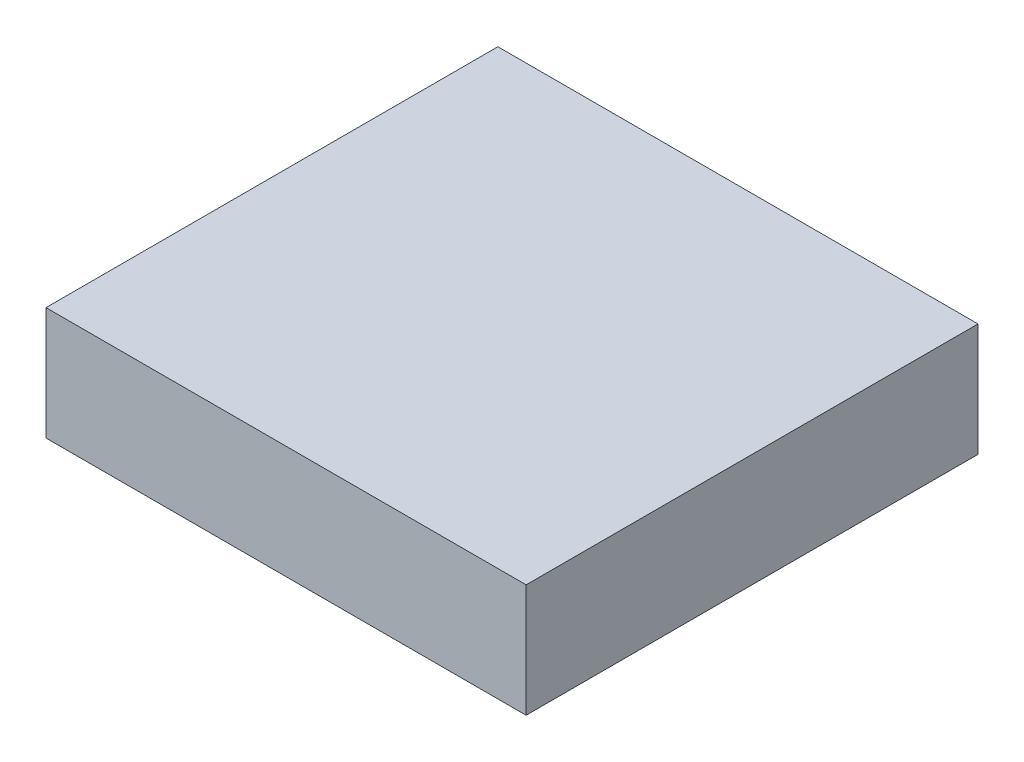
ISO-10303-21;
HEADER;
FILE_DESCRIPTION(('STEP AP214'),'2;1');
FILE_NAME('part.step','',(''),(''),'','','');
FILE_SCHEMA(('AUTOMOTIVE_DESIGN { 1 0 10303 214 1 1 1 1 }'));
ENDSEC;
DATA;
#1=APPLICATION_CONTEXT('core data for automotive mechanical design processes');
#2=APPLICATION_PROTOCOL_DEFINITION('international standard','automotive_design',2000,#1);
#3=PRODUCT_CONTEXT('',#1,'mechanical');
#4=PRODUCT('Part','Part','',(#3));
#5=PRODUCT_RELATED_PRODUCT_CATEGORY('part','',(#4));
#6=PRODUCT_DEFINITION_FORMATION('','',#4);
#7=PRODUCT_DEFINITION_CONTEXT('part definition',#1,'design');
#8=PRODUCT_DEFINITION('design','',#6,#7);
#9=PRODUCT_DEFINITION_SHAPE('','',#8);
#10=(LENGTH_UNIT() NAMED_UNIT(*) SI_UNIT(.MILLI.,.METRE.));
#11=(NAMED_UNIT(*) PLANE_ANGLE_UNIT() SI_UNIT($,.RADIAN.));
#12=(NAMED_UNIT(*) SI_UNIT($,.STERADIAN.) SOLID_ANGLE_UNIT());
#13=UNCERTAINTY_MEASURE_WITH_UNIT(LENGTH_MEASURE(1.E-05),#10,'distance_accuracy_value','');
#14=(GEOMETRIC_REPRESENTATION_CONTEXT(3) GLOBAL_UNCERTAINTY_ASSIGNED_CONTEXT((#13)) GLOBAL_UNIT_ASSIGNED_CONTEXT((#10,
#11,#12)) REPRESENTATION_CONTEXT('',''));
#15=CARTESIAN_POINT('',(0.,0.,0.));
#16=DIRECTION('',(0.,0.,1.));
#17=DIRECTION('',(1.,0.,0.));
#18=AXIS2_PLACEMENT_3D('',#15,#16,#17);
#19=CARTESIAN_POINT('',(-25.5,12.,24.));
#20=DIRECTION('',(1.,0.,0.));
#21=DIRECTION('',(0.,0.,-1.));
#22=AXIS2_PLACEMENT_3D('',#19,#20,#21);
#23=PLANE('',#22);
#24=DIRECTION('',(0.,0.,1.));
#25=VECTOR('',#24,1.);
#26=CARTESIAN_POINT('',(-25.5,0.,24.));
#27=LINE('',#26,#25);
#28=CARTESIAN_POINT('',(-25.5,0.,-24.));
#29=VERTEX_POINT('',#28);
#30=CARTESIAN_POINT('',(-25.5,0.,24.));
#31=VERTEX_POINT('',#30);
#32=EDGE_CURVE('E96',#29,#31,#27,.T.);
#33=ORIENTED_EDGE('',*,*,#32,.T.);
#34=DIRECTION('',(0.,-1.,0.));
#35=VECTOR('',#34,1.);
#36=CARTESIAN_POINT('',(-25.5,12.,24.));
#37=LINE('',#36,#35);
#38=CARTESIAN_POINT('',(-25.5,12.,24.));
#39=VERTEX_POINT('',#38);
#40=EDGE_CURVE('E11',#39,#31,#37,.T.);
#41=ORIENTED_EDGE('',*,*,#40,.F.);
#42=DIRECTION('',(0.,0.,1.));
#43=VECTOR('',#42,1.);
#44=CARTESIAN_POINT('',(-25.5,12.,24.));
#45=LINE('',#44,#43);
#46=CARTESIAN_POINT('',(-25.5,12.,-24.));
#47=VERTEX_POINT('',#46);
#48=EDGE_CURVE('E84',#47,#39,#45,.T.);
#49=ORIENTED_EDGE('',*,*,#48,.F.);
#50=DIRECTION('',(0.,-1.,0.));
#51=VECTOR('',#50,1.);
#52=CARTESIAN_POINT('',(-25.5,12.,-24.));
#53=LINE('',#52,#51);
#54=EDGE_CURVE('E92',#47,#29,#53,.T.);
#55=ORIENTED_EDGE('',*,*,#54,.T.);
#56=EDGE_LOOP('',(#33,#41,#49,#55));
#57=FACE_BOUND('',#56,.T.);
#58=ADVANCED_FACE('F33',(#57),#23,.F.);
#59=CARTESIAN_POINT('',(25.5,12.,24.));
#60=DIRECTION('',(0.,0.,-1.));
#61=DIRECTION('',(-1.,0.,0.));
#62=AXIS2_PLACEMENT_3D('',#59,#60,#61);
#63=PLANE('',#62);
#64=DIRECTION('',(1.,0.,0.));
#65=VECTOR('',#64,1.);
#66=CARTESIAN_POINT('',(25.5,0.,24.));
#67=LINE('',#66,#65);
#68=CARTESIAN_POINT('',(25.5,0.,24.));
#69=VERTEX_POINT('',#68);
#70=EDGE_CURVE('E88',#31,#69,#67,.T.);
#71=ORIENTED_EDGE('',*,*,#70,.T.);
#72=DIRECTION('',(0.,-1.,0.));
#73=VECTOR('',#72,1.);
#74=CARTESIAN_POINT('',(25.5,12.,24.));
#75=LINE('',#74,#73);
#76=CARTESIAN_POINT('',(25.5,12.,24.));
#77=VERTEX_POINT('',#76);
#78=EDGE_CURVE('E41',#77,#69,#75,.T.);
#79=ORIENTED_EDGE('',*,*,#78,.F.);
#80=DIRECTION('',(1.,0.,0.));
#81=VECTOR('',#80,1.);
#82=CARTESIAN_POINT('',(25.5,12.,24.));
#83=LINE('',#82,#81);
#84=EDGE_CURVE('E79',#39,#77,#83,.T.);
#85=ORIENTED_EDGE('',*,*,#84,.F.);
#86=ORIENTED_EDGE('',*,*,#40,.T.);
#87=EDGE_LOOP('',(#71,#79,#85,#86));
#88=FACE_BOUND('',#87,.T.);
#89=ADVANCED_FACE('F87',(#88),#63,.F.);
#90=CARTESIAN_POINT('',(25.5,12.,24.));
#91=DIRECTION('',(-1.,0.,0.));
#92=DIRECTION('',(0.,0.,1.));
#93=AXIS2_PLACEMENT_3D('',#90,#91,#92);
#94=PLANE('',#93);
#95=DIRECTION('',(0.,0.,-1.));
#96=VECTOR('',#95,1.);
#97=CARTESIAN_POINT('',(25.5,0.,24.));
#98=LINE('',#97,#96);
#99=CARTESIAN_POINT('',(25.5,0.,-24.));
#100=VERTEX_POINT('',#99);
#101=EDGE_CURVE('E66',#69,#100,#98,.T.);
#102=ORIENTED_EDGE('',*,*,#101,.T.);
#103=DIRECTION('',(0.,-1.,0.));
#104=VECTOR('',#103,1.);
#105=CARTESIAN_POINT('',(25.5,12.,-24.));
#106=LINE('',#105,#104);
#107=CARTESIAN_POINT('',(25.5,12.,-24.));
#108=VERTEX_POINT('',#107);
#109=EDGE_CURVE('E89',#108,#100,#106,.T.);
#110=ORIENTED_EDGE('',*,*,#109,.F.);
#111=DIRECTION('',(0.,0.,-1.));
#112=VECTOR('',#111,1.);
#113=CARTESIAN_POINT('',(25.5,12.,24.));
#114=LINE('',#113,#112);
#115=EDGE_CURVE('E82',#77,#108,#114,.T.);
#116=ORIENTED_EDGE('',*,*,#115,.F.);
#117=ORIENTED_EDGE('',*,*,#78,.T.);
#118=EDGE_LOOP('',(#102,#110,#116,#117));
#119=FACE_BOUND('',#118,.T.);
#120=ADVANCED_FACE('F90',(#119),#94,.F.);
#121=CARTESIAN_POINT('',(25.5,12.,-24.));
#122=DIRECTION('',(0.,0.,1.));
#123=DIRECTION('',(1.,0.,0.));
#124=AXIS2_PLACEMENT_3D('',#121,#122,#123);
#125=PLANE('',#124);
#126=DIRECTION('',(-1.,0.,0.));
#127=VECTOR('',#126,1.);
#128=CARTESIAN_POINT('',(25.5,0.,-24.));
#129=LINE('',#128,#127);
#130=EDGE_CURVE('E72',#100,#29,#129,.T.);
#131=ORIENTED_EDGE('',*,*,#130,.T.);
#132=ORIENTED_EDGE('',*,*,#54,.F.);
#133=DIRECTION('',(-1.,0.,0.));
#134=VECTOR('',#133,1.);
#135=CARTESIAN_POINT('',(25.5,12.,-24.));
#136=LINE('',#135,#134);
#137=EDGE_CURVE('E49',#108,#47,#136,.T.);
#138=ORIENTED_EDGE('',*,*,#137,.F.);
#139=ORIENTED_EDGE('',*,*,#109,.T.);
#140=EDGE_LOOP('',(#131,#132,#138,#139));
#141=FACE_BOUND('',#140,.T.);
#142=ADVANCED_FACE('F103',(#141),#125,.F.);
#143=CARTESIAN_POINT('',(0.,12.,0.));
#144=DIRECTION('',(0.,1.,0.));
#145=DIRECTION('',(0.,0.,1.));
#146=AXIS2_PLACEMENT_3D('',#143,#144,#145);
#147=PLANE('',#146);
#148=ORIENTED_EDGE('',*,*,#48,.T.);
#149=ORIENTED_EDGE('',*,*,#84,.T.);
#150=ORIENTED_EDGE('',*,*,#115,.T.);
#151=ORIENTED_EDGE('',*,*,#137,.T.);
#152=EDGE_LOOP('',(#148,#149,#150,#151));
#153=FACE_BOUND('',#152,.T.);
#154=ADVANCED_FACE('F80',(#153),#147,.T.);
#155=CARTESIAN_POINT('',(0.,0.,0.));
#156=DIRECTION('',(0.,1.,0.));
#157=DIRECTION('',(0.,0.,1.));
#158=AXIS2_PLACEMENT_3D('',#155,#156,#157);
#159=PLANE('',#158);
#160=ORIENTED_EDGE('',*,*,#32,.F.);
#161=ORIENTED_EDGE('',*,*,#130,.F.);
#162=ORIENTED_EDGE('',*,*,#101,.F.);
#163=ORIENTED_EDGE('',*,*,#70,.F.);
#164=EDGE_LOOP('',(#160,#161,#162,#163));
#165=FACE_BOUND('',#164,.T.);
#166=ADVANCED_FACE('F106',(#165),#159,.F.);
#167=CLOSED_SHELL('',(#58,#89,#120,#142,#154,#166));
#168=MANIFOLD_SOLID_BREP('B2',#167);
#169=ADVANCED_BREP_SHAPE_REPRESENTATION('',(#18,#168),#14);
#170=SHAPE_DEFINITION_REPRESENTATION(#9,#169);
ENDSEC;
END-ISO-10303-21;
